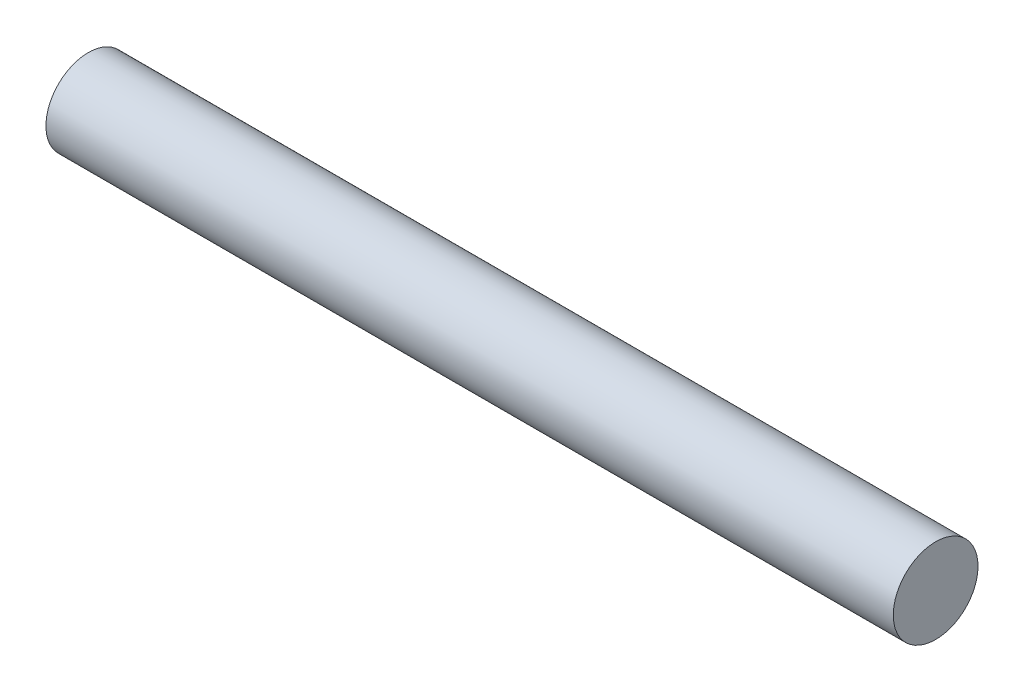
ISO-10303-21;
HEADER;
FILE_DESCRIPTION(('STEP AP214'),'2;1');
FILE_NAME('part.step','',(''),(''),'','','');
FILE_SCHEMA(('AUTOMOTIVE_DESIGN { 1 0 10303 214 1 1 1 1 }'));
ENDSEC;
DATA;
#1=APPLICATION_CONTEXT('core data for automotive mechanical design processes');
#2=APPLICATION_PROTOCOL_DEFINITION('international standard','automotive_design',2000,#1);
#3=PRODUCT_CONTEXT('',#1,'mechanical');
#4=PRODUCT('Part','Part','',(#3));
#5=PRODUCT_RELATED_PRODUCT_CATEGORY('part','',(#4));
#6=PRODUCT_DEFINITION_FORMATION('','',#4);
#7=PRODUCT_DEFINITION_CONTEXT('part definition',#1,'design');
#8=PRODUCT_DEFINITION('design','',#6,#7);
#9=PRODUCT_DEFINITION_SHAPE('','',#8);
#10=(LENGTH_UNIT() NAMED_UNIT(*) SI_UNIT(.MILLI.,.METRE.));
#11=(NAMED_UNIT(*) PLANE_ANGLE_UNIT() SI_UNIT($,.RADIAN.));
#12=(NAMED_UNIT(*) SI_UNIT($,.STERADIAN.) SOLID_ANGLE_UNIT());
#13=UNCERTAINTY_MEASURE_WITH_UNIT(LENGTH_MEASURE(1.E-05),#10,'distance_accuracy_value','');
#14=(GEOMETRIC_REPRESENTATION_CONTEXT(3) GLOBAL_UNCERTAINTY_ASSIGNED_CONTEXT((#13)) GLOBAL_UNIT_ASSIGNED_CONTEXT((#10,
#11,#12)) REPRESENTATION_CONTEXT('',''));
#15=CARTESIAN_POINT('',(0.,0.,0.));
#16=DIRECTION('',(0.,0.,1.));
#17=DIRECTION('',(1.,0.,0.));
#18=AXIS2_PLACEMENT_3D('',#15,#16,#17);
#19=CARTESIAN_POINT('',(30.,0.,0.));
#20=DIRECTION('',(-1.,0.,0.));
#21=DIRECTION('',(0.,0.,1.));
#22=AXIS2_PLACEMENT_3D('',#19,#20,#21);
#23=CYLINDRICAL_SURFACE('',#22,1.5);
#24=CARTESIAN_POINT('',(30.,0.,0.));
#25=DIRECTION('',(1.,0.,0.));
#26=DIRECTION('',(0.,0.,-1.));
#27=AXIS2_PLACEMENT_3D('',#24,#25,#26);
#28=CIRCLE('',#27,1.5);
#29=CARTESIAN_POINT('',(30.,0.,-1.5));
#30=VERTEX_POINT('',#29);
#31=EDGE_CURVE('E10',#30,#30,#28,.T.);
#32=ORIENTED_EDGE('',*,*,#31,.F.);
#33=EDGE_LOOP('',(#32));
#34=FACE_BOUND('',#33,.T.);
#35=CARTESIAN_POINT('',(0.,0.,0.));
#36=DIRECTION('',(1.,0.,0.));
#37=DIRECTION('',(0.,0.,-1.));
#38=AXIS2_PLACEMENT_3D('',#35,#36,#37);
#39=CIRCLE('',#38,1.5);
#40=CARTESIAN_POINT('',(0.,0.,-1.5));
#41=VERTEX_POINT('',#40);
#42=EDGE_CURVE('E34',#41,#41,#39,.T.);
#43=ORIENTED_EDGE('',*,*,#42,.T.);
#44=EDGE_LOOP('',(#43));
#45=FACE_BOUND('',#44,.T.);
#46=ADVANCED_FACE('F31',(#34,#45),#23,.T.);
#47=CARTESIAN_POINT('',(30.,0.,0.));
#48=DIRECTION('',(1.,0.,0.));
#49=DIRECTION('',(0.,0.,-1.));
#50=AXIS2_PLACEMENT_3D('',#47,#48,#49);
#51=PLANE('',#50);
#52=ORIENTED_EDGE('',*,*,#31,.T.);
#53=EDGE_LOOP('',(#52));
#54=FACE_BOUND('',#53,.T.);
#55=ADVANCED_FACE('F46',(#54),#51,.T.);
#56=CARTESIAN_POINT('',(0.,0.,0.));
#57=DIRECTION('',(1.,0.,0.));
#58=DIRECTION('',(0.,0.,-1.));
#59=AXIS2_PLACEMENT_3D('',#56,#57,#58);
#60=PLANE('',#59);
#61=ORIENTED_EDGE('',*,*,#42,.F.);
#62=EDGE_LOOP('',(#61));
#63=FACE_BOUND('',#62,.T.);
#64=ADVANCED_FACE('F44',(#63),#60,.F.);
#65=CLOSED_SHELL('',(#46,#55,#64));
#66=MANIFOLD_SOLID_BREP('B2',#65);
#67=ADVANCED_BREP_SHAPE_REPRESENTATION('',(#18,#66),#14);
#68=SHAPE_DEFINITION_REPRESENTATION(#9,#67);
ENDSEC;
END-ISO-10303-21;
